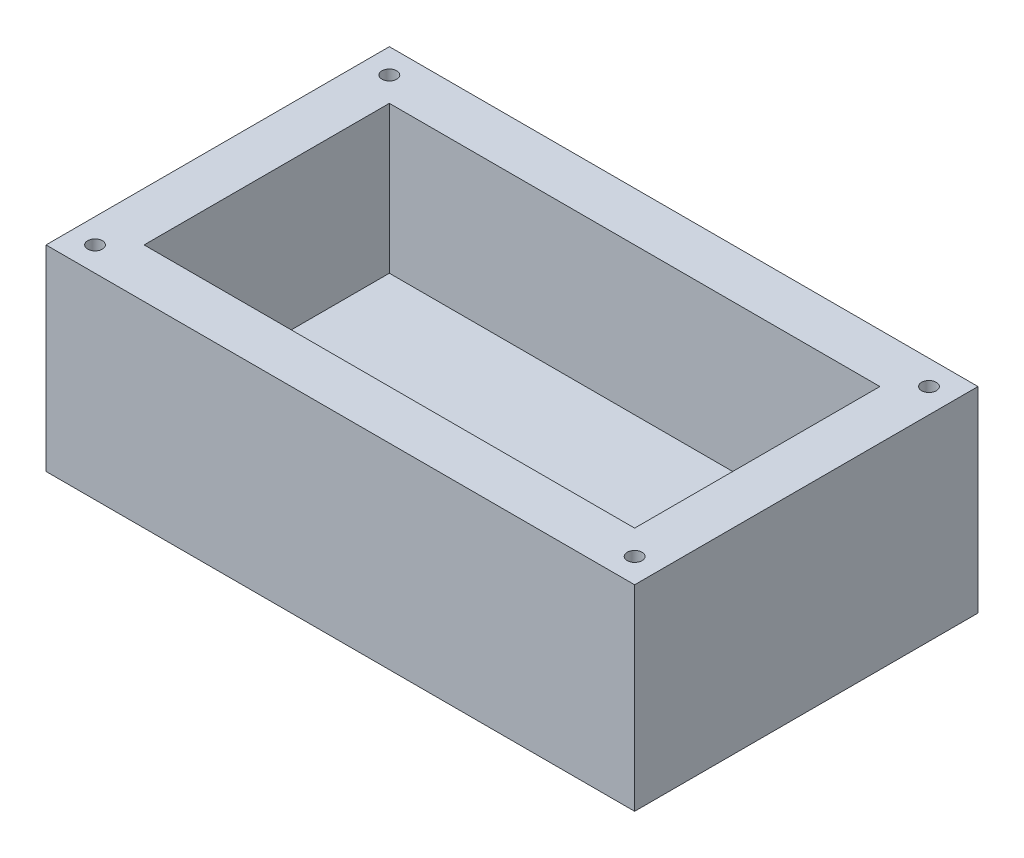
ISO-10303-21;
HEADER;
FILE_DESCRIPTION(('STEP AP214'),'2;1');
FILE_NAME('part.step','',(''),(''),'','','');
FILE_SCHEMA(('AUTOMOTIVE_DESIGN { 1 0 10303 214 1 1 1 1 }'));
ENDSEC;
DATA;
#1=APPLICATION_CONTEXT('core data for automotive mechanical design processes');
#2=APPLICATION_PROTOCOL_DEFINITION('international standard','automotive_design',2000,#1);
#3=PRODUCT_CONTEXT('',#1,'mechanical');
#4=PRODUCT('Part','Part','',(#3));
#5=PRODUCT_RELATED_PRODUCT_CATEGORY('part','',(#4));
#6=PRODUCT_DEFINITION_FORMATION('','',#4);
#7=PRODUCT_DEFINITION_CONTEXT('part definition',#1,'design');
#8=PRODUCT_DEFINITION('design','',#6,#7);
#9=PRODUCT_DEFINITION_SHAPE('','',#8);
#10=(LENGTH_UNIT() NAMED_UNIT(*) SI_UNIT(.MILLI.,.METRE.));
#11=(NAMED_UNIT(*) PLANE_ANGLE_UNIT() SI_UNIT($,.RADIAN.));
#12=(NAMED_UNIT(*) SI_UNIT($,.STERADIAN.) SOLID_ANGLE_UNIT());
#13=UNCERTAINTY_MEASURE_WITH_UNIT(LENGTH_MEASURE(1.E-05),#10,'distance_accuracy_value','');
#14=(GEOMETRIC_REPRESENTATION_CONTEXT(3) GLOBAL_UNCERTAINTY_ASSIGNED_CONTEXT((#13)) GLOBAL_UNIT_ASSIGNED_CONTEXT((#10,
#11,#12)) REPRESENTATION_CONTEXT('',''));
#15=CARTESIAN_POINT('',(0.,0.,0.));
#16=DIRECTION('',(0.,0.,1.));
#17=DIRECTION('',(1.,0.,0.));
#18=AXIS2_PLACEMENT_3D('',#15,#16,#17);
#19=CARTESIAN_POINT('',(60.,40.,-35.));
#20=DIRECTION('',(-1.,0.,0.));
#21=DIRECTION('',(0.,0.,1.));
#22=AXIS2_PLACEMENT_3D('',#19,#20,#21);
#23=PLANE('',#22);
#24=DIRECTION('',(0.,0.,-1.));
#25=VECTOR('',#24,1.);
#26=CARTESIAN_POINT('',(60.,0.,-35.));
#27=LINE('',#26,#25);
#28=CARTESIAN_POINT('',(60.,0.,35.));
#29=VERTEX_POINT('',#28);
#30=CARTESIAN_POINT('',(60.,0.,-35.));
#31=VERTEX_POINT('',#30);
#32=EDGE_CURVE('E147',#29,#31,#27,.T.);
#33=ORIENTED_EDGE('',*,*,#32,.T.);
#34=DIRECTION('',(0.,-1.,0.));
#35=VECTOR('',#34,1.);
#36=CARTESIAN_POINT('',(60.,40.,-35.));
#37=LINE('',#36,#35);
#38=CARTESIAN_POINT('',(60.,40.,-35.));
#39=VERTEX_POINT('',#38);
#40=EDGE_CURVE('E11',#39,#31,#37,.T.);
#41=ORIENTED_EDGE('',*,*,#40,.F.);
#42=DIRECTION('',(0.,0.,-1.));
#43=VECTOR('',#42,1.);
#44=CARTESIAN_POINT('',(60.,40.,-35.));
#45=LINE('',#44,#43);
#46=CARTESIAN_POINT('',(60.,40.,35.));
#47=VERTEX_POINT('',#46);
#48=EDGE_CURVE('E151',#47,#39,#45,.T.);
#49=ORIENTED_EDGE('',*,*,#48,.F.);
#50=DIRECTION('',(0.,-1.,0.));
#51=VECTOR('',#50,1.);
#52=CARTESIAN_POINT('',(60.,40.,35.));
#53=LINE('',#52,#51);
#54=EDGE_CURVE('E157',#47,#29,#53,.T.);
#55=ORIENTED_EDGE('',*,*,#54,.T.);
#56=EDGE_LOOP('',(#33,#41,#49,#55));
#57=FACE_BOUND('',#56,.T.);
#58=ADVANCED_FACE('F35',(#57),#23,.F.);
#59=CARTESIAN_POINT('',(-60.,40.,-35.));
#60=DIRECTION('',(0.,0.,1.));
#61=DIRECTION('',(1.,0.,0.));
#62=AXIS2_PLACEMENT_3D('',#59,#60,#61);
#63=PLANE('',#62);
#64=DIRECTION('',(-1.,0.,0.));
#65=VECTOR('',#64,1.);
#66=CARTESIAN_POINT('',(-60.,0.,-35.));
#67=LINE('',#66,#65);
#68=CARTESIAN_POINT('',(-60.,0.,-35.));
#69=VERTEX_POINT('',#68);
#70=EDGE_CURVE('E160',#31,#69,#67,.T.);
#71=ORIENTED_EDGE('',*,*,#70,.T.);
#72=DIRECTION('',(0.,-1.,0.));
#73=VECTOR('',#72,1.);
#74=CARTESIAN_POINT('',(-60.,40.,-35.));
#75=LINE('',#74,#73);
#76=CARTESIAN_POINT('',(-60.,40.,-35.));
#77=VERTEX_POINT('',#76);
#78=EDGE_CURVE('E42',#77,#69,#75,.T.);
#79=ORIENTED_EDGE('',*,*,#78,.F.);
#80=DIRECTION('',(-1.,0.,0.));
#81=VECTOR('',#80,1.);
#82=CARTESIAN_POINT('',(-60.,40.,-35.));
#83=LINE('',#82,#81);
#84=EDGE_CURVE('E86',#39,#77,#83,.T.);
#85=ORIENTED_EDGE('',*,*,#84,.F.);
#86=ORIENTED_EDGE('',*,*,#40,.T.);
#87=EDGE_LOOP('',(#71,#79,#85,#86));
#88=FACE_BOUND('',#87,.T.);
#89=ADVANCED_FACE('F189',(#88),#63,.F.);
#90=CARTESIAN_POINT('',(-60.,40.,-35.));
#91=DIRECTION('',(1.,0.,0.));
#92=DIRECTION('',(0.,0.,-1.));
#93=AXIS2_PLACEMENT_3D('',#90,#91,#92);
#94=PLANE('',#93);
#95=DIRECTION('',(0.,0.,1.));
#96=VECTOR('',#95,1.);
#97=CARTESIAN_POINT('',(-60.,0.,-35.));
#98=LINE('',#97,#96);
#99=CARTESIAN_POINT('',(-60.,0.,35.));
#100=VERTEX_POINT('',#99);
#101=EDGE_CURVE('E162',#69,#100,#98,.T.);
#102=ORIENTED_EDGE('',*,*,#101,.T.);
#103=DIRECTION('',(0.,-1.,0.));
#104=VECTOR('',#103,1.);
#105=CARTESIAN_POINT('',(-60.,40.,35.));
#106=LINE('',#105,#104);
#107=CARTESIAN_POINT('',(-60.,40.,35.));
#108=VERTEX_POINT('',#107);
#109=EDGE_CURVE('E166',#108,#100,#106,.T.);
#110=ORIENTED_EDGE('',*,*,#109,.F.);
#111=DIRECTION('',(0.,0.,1.));
#112=VECTOR('',#111,1.);
#113=CARTESIAN_POINT('',(-60.,40.,-35.));
#114=LINE('',#113,#112);
#115=EDGE_CURVE('E154',#77,#108,#114,.T.);
#116=ORIENTED_EDGE('',*,*,#115,.F.);
#117=ORIENTED_EDGE('',*,*,#78,.T.);
#118=EDGE_LOOP('',(#102,#110,#116,#117));
#119=FACE_BOUND('',#118,.T.);
#120=ADVANCED_FACE('F171',(#119),#94,.F.);
#121=CARTESIAN_POINT('',(-60.,40.,35.));
#122=DIRECTION('',(0.,0.,-1.));
#123=DIRECTION('',(-1.,0.,0.));
#124=AXIS2_PLACEMENT_3D('',#121,#122,#123);
#125=PLANE('',#124);
#126=DIRECTION('',(1.,0.,0.));
#127=VECTOR('',#126,1.);
#128=CARTESIAN_POINT('',(-60.,0.,35.));
#129=LINE('',#128,#127);
#130=EDGE_CURVE('E79',#100,#29,#129,.T.);
#131=ORIENTED_EDGE('',*,*,#130,.T.);
#132=ORIENTED_EDGE('',*,*,#54,.F.);
#133=DIRECTION('',(1.,0.,0.));
#134=VECTOR('',#133,1.);
#135=CARTESIAN_POINT('',(-60.,40.,35.));
#136=LINE('',#135,#134);
#137=EDGE_CURVE('E58',#108,#47,#136,.T.);
#138=ORIENTED_EDGE('',*,*,#137,.F.);
#139=ORIENTED_EDGE('',*,*,#109,.T.);
#140=EDGE_LOOP('',(#131,#132,#138,#139));
#141=FACE_BOUND('',#140,.T.);
#142=ADVANCED_FACE('F179',(#141),#125,.F.);
#143=CARTESIAN_POINT('',(0.,40.,0.));
#144=DIRECTION('',(0.,1.,0.));
#145=DIRECTION('',(0.,0.,1.));
#146=AXIS2_PLACEMENT_3D('',#143,#144,#145);
#147=PLANE('',#146);
#148=CARTESIAN_POINT('',(55.,40.,30.));
#149=DIRECTION('',(0.,1.,0.));
#150=DIRECTION('',(0.,0.,1.));
#151=AXIS2_PLACEMENT_3D('',#148,#149,#150);
#152=CIRCLE('',#151,1.5);
#153=CARTESIAN_POINT('',(55.,40.,31.5));
#154=VERTEX_POINT('',#153);
#155=EDGE_CURVE('E351',#154,#154,#152,.T.);
#156=ORIENTED_EDGE('',*,*,#155,.F.);
#157=EDGE_LOOP('',(#156));
#158=FACE_BOUND('',#157,.T.);
#159=CARTESIAN_POINT('',(55.,40.,-30.));
#160=DIRECTION('',(0.,1.,0.));
#161=DIRECTION('',(0.,0.,1.));
#162=AXIS2_PLACEMENT_3D('',#159,#160,#161);
#163=CIRCLE('',#162,1.5);
#164=CARTESIAN_POINT('',(55.,40.,-28.5));
#165=VERTEX_POINT('',#164);
#166=EDGE_CURVE('E350',#165,#165,#163,.T.);
#167=ORIENTED_EDGE('',*,*,#166,.F.);
#168=EDGE_LOOP('',(#167));
#169=FACE_BOUND('',#168,.T.);
#170=CARTESIAN_POINT('',(-55.,40.,-30.));
#171=DIRECTION('',(0.,1.,0.));
#172=DIRECTION('',(0.,0.,1.));
#173=AXIS2_PLACEMENT_3D('',#170,#171,#172);
#174=CIRCLE('',#173,1.5);
#175=CARTESIAN_POINT('',(-55.,40.,-28.5));
#176=VERTEX_POINT('',#175);
#177=EDGE_CURVE('E360',#176,#176,#174,.T.);
#178=ORIENTED_EDGE('',*,*,#177,.F.);
#179=EDGE_LOOP('',(#178));
#180=FACE_BOUND('',#179,.T.);
#181=CARTESIAN_POINT('',(-55.,40.,30.));
#182=DIRECTION('',(0.,1.,0.));
#183=DIRECTION('',(0.,0.,1.));
#184=AXIS2_PLACEMENT_3D('',#181,#182,#183);
#185=CIRCLE('',#184,1.5);
#186=CARTESIAN_POINT('',(-55.,40.,31.5));
#187=VERTEX_POINT('',#186);
#188=EDGE_CURVE('E134',#187,#187,#185,.T.);
#189=ORIENTED_EDGE('',*,*,#188,.F.);
#190=EDGE_LOOP('',(#189));
#191=FACE_BOUND('',#190,.T.);
#192=DIRECTION('',(0.,0.,-1.));
#193=VECTOR('',#192,1.);
#194=CARTESIAN_POINT('',(50.,40.,-25.));
#195=LINE('',#194,#193);
#196=CARTESIAN_POINT('',(50.,40.,25.));
#197=VERTEX_POINT('',#196);
#198=CARTESIAN_POINT('',(50.,40.,-25.));
#199=VERTEX_POINT('',#198);
#200=EDGE_CURVE('E49',#197,#199,#195,.T.);
#201=ORIENTED_EDGE('',*,*,#200,.F.);
#202=DIRECTION('',(1.,0.,0.));
#203=VECTOR('',#202,1.);
#204=CARTESIAN_POINT('',(-50.,40.,25.));
#205=LINE('',#204,#203);
#206=CARTESIAN_POINT('',(-50.,40.,25.));
#207=VERTEX_POINT('',#206);
#208=EDGE_CURVE('E128',#207,#197,#205,.T.);
#209=ORIENTED_EDGE('',*,*,#208,.F.);
#210=DIRECTION('',(0.,0.,1.));
#211=VECTOR('',#210,1.);
#212=CARTESIAN_POINT('',(-50.,40.,-25.));
#213=LINE('',#212,#211);
#214=CARTESIAN_POINT('',(-50.,40.,-25.));
#215=VERTEX_POINT('',#214);
#216=EDGE_CURVE('E131',#215,#207,#213,.T.);
#217=ORIENTED_EDGE('',*,*,#216,.F.);
#218=DIRECTION('',(-1.,0.,0.));
#219=VECTOR('',#218,1.);
#220=CARTESIAN_POINT('',(-50.,40.,-25.));
#221=LINE('',#220,#219);
#222=EDGE_CURVE('E140',#199,#215,#221,.T.);
#223=ORIENTED_EDGE('',*,*,#222,.F.);
#224=EDGE_LOOP('',(#201,#209,#217,#223));
#225=FACE_BOUND('',#224,.T.);
#226=ORIENTED_EDGE('',*,*,#48,.T.);
#227=ORIENTED_EDGE('',*,*,#84,.T.);
#228=ORIENTED_EDGE('',*,*,#115,.T.);
#229=ORIENTED_EDGE('',*,*,#137,.T.);
#230=EDGE_LOOP('',(#226,#227,#228,#229));
#231=FACE_BOUND('',#230,.T.);
#232=ADVANCED_FACE('F181',(#158,#169,#180,#191,#225,#231),#147,.T.);
#233=CARTESIAN_POINT('',(0.,0.,0.));
#234=DIRECTION('',(0.,1.,0.));
#235=DIRECTION('',(0.,0.,1.));
#236=AXIS2_PLACEMENT_3D('',#233,#234,#235);
#237=PLANE('',#236);
#238=ORIENTED_EDGE('',*,*,#32,.F.);
#239=ORIENTED_EDGE('',*,*,#130,.F.);
#240=ORIENTED_EDGE('',*,*,#101,.F.);
#241=ORIENTED_EDGE('',*,*,#70,.F.);
#242=EDGE_LOOP('',(#238,#239,#240,#241));
#243=FACE_BOUND('',#242,.T.);
#244=ADVANCED_FACE('F175',(#243),#237,.F.);
#245=CARTESIAN_POINT('',(50.,10.,-25.));
#246=DIRECTION('',(1.,0.,0.));
#247=DIRECTION('',(0.,0.,-1.));
#248=AXIS2_PLACEMENT_3D('',#245,#246,#247);
#249=PLANE('',#248);
#250=ORIENTED_EDGE('',*,*,#200,.T.);
#251=DIRECTION('',(0.,1.,0.));
#252=VECTOR('',#251,1.);
#253=CARTESIAN_POINT('',(50.,10.,-25.));
#254=LINE('',#253,#252);
#255=CARTESIAN_POINT('',(50.,10.,-25.));
#256=VERTEX_POINT('',#255);
#257=EDGE_CURVE('E106',#256,#199,#254,.T.);
#258=ORIENTED_EDGE('',*,*,#257,.F.);
#259=DIRECTION('',(0.,0.,-1.));
#260=VECTOR('',#259,1.);
#261=CARTESIAN_POINT('',(50.,10.,-25.));
#262=LINE('',#261,#260);
#263=CARTESIAN_POINT('',(50.,10.,25.));
#264=VERTEX_POINT('',#263);
#265=EDGE_CURVE('E110',#264,#256,#262,.T.);
#266=ORIENTED_EDGE('',*,*,#265,.F.);
#267=DIRECTION('',(0.,1.,0.));
#268=VECTOR('',#267,1.);
#269=CARTESIAN_POINT('',(50.,10.,25.));
#270=LINE('',#269,#268);
#271=EDGE_CURVE('E145',#264,#197,#270,.T.);
#272=ORIENTED_EDGE('',*,*,#271,.T.);
#273=EDGE_LOOP('',(#250,#258,#266,#272));
#274=FACE_BOUND('',#273,.T.);
#275=ADVANCED_FACE('F108',(#274),#249,.F.);
#276=CARTESIAN_POINT('',(-50.,10.,25.));
#277=DIRECTION('',(0.,0.,1.));
#278=DIRECTION('',(1.,0.,0.));
#279=AXIS2_PLACEMENT_3D('',#276,#277,#278);
#280=PLANE('',#279);
#281=ORIENTED_EDGE('',*,*,#208,.T.);
#282=ORIENTED_EDGE('',*,*,#271,.F.);
#283=DIRECTION('',(1.,0.,0.));
#284=VECTOR('',#283,1.);
#285=CARTESIAN_POINT('',(-50.,10.,25.));
#286=LINE('',#285,#284);
#287=CARTESIAN_POINT('',(-50.,10.,25.));
#288=VERTEX_POINT('',#287);
#289=EDGE_CURVE('E116',#288,#264,#286,.T.);
#290=ORIENTED_EDGE('',*,*,#289,.F.);
#291=DIRECTION('',(0.,1.,0.));
#292=VECTOR('',#291,1.);
#293=CARTESIAN_POINT('',(-50.,10.,25.));
#294=LINE('',#293,#292);
#295=EDGE_CURVE('E148',#288,#207,#294,.T.);
#296=ORIENTED_EDGE('',*,*,#295,.T.);
#297=EDGE_LOOP('',(#281,#282,#290,#296));
#298=FACE_BOUND('',#297,.T.);
#299=ADVANCED_FACE('F223',(#298),#280,.F.);
#300=CARTESIAN_POINT('',(-50.,10.,-25.));
#301=DIRECTION('',(-1.,0.,0.));
#302=DIRECTION('',(0.,0.,1.));
#303=AXIS2_PLACEMENT_3D('',#300,#301,#302);
#304=PLANE('',#303);
#305=ORIENTED_EDGE('',*,*,#216,.T.);
#306=ORIENTED_EDGE('',*,*,#295,.F.);
#307=DIRECTION('',(0.,0.,1.));
#308=VECTOR('',#307,1.);
#309=CARTESIAN_POINT('',(-50.,10.,-25.));
#310=LINE('',#309,#308);
#311=CARTESIAN_POINT('',(-50.,10.,-25.));
#312=VERTEX_POINT('',#311);
#313=EDGE_CURVE('E124',#312,#288,#310,.T.);
#314=ORIENTED_EDGE('',*,*,#313,.F.);
#315=DIRECTION('',(0.,1.,0.));
#316=VECTOR('',#315,1.);
#317=CARTESIAN_POINT('',(-50.,10.,-25.));
#318=LINE('',#317,#316);
#319=EDGE_CURVE('E115',#312,#215,#318,.T.);
#320=ORIENTED_EDGE('',*,*,#319,.T.);
#321=EDGE_LOOP('',(#305,#306,#314,#320));
#322=FACE_BOUND('',#321,.T.);
#323=ADVANCED_FACE('F232',(#322),#304,.F.);
#324=CARTESIAN_POINT('',(-50.,10.,-25.));
#325=DIRECTION('',(0.,0.,-1.));
#326=DIRECTION('',(-1.,0.,0.));
#327=AXIS2_PLACEMENT_3D('',#324,#325,#326);
#328=PLANE('',#327);
#329=ORIENTED_EDGE('',*,*,#222,.T.);
#330=ORIENTED_EDGE('',*,*,#319,.F.);
#331=DIRECTION('',(-1.,0.,0.));
#332=VECTOR('',#331,1.);
#333=CARTESIAN_POINT('',(-50.,10.,-25.));
#334=LINE('',#333,#332);
#335=EDGE_CURVE('E119',#256,#312,#334,.T.);
#336=ORIENTED_EDGE('',*,*,#335,.F.);
#337=ORIENTED_EDGE('',*,*,#257,.T.);
#338=EDGE_LOOP('',(#329,#330,#336,#337));
#339=FACE_BOUND('',#338,.T.);
#340=ADVANCED_FACE('F120',(#339),#328,.F.);
#341=CARTESIAN_POINT('',(0.,10.,0.));
#342=DIRECTION('',(0.,1.,0.));
#343=DIRECTION('',(0.,0.,1.));
#344=AXIS2_PLACEMENT_3D('',#341,#342,#343);
#345=PLANE('',#344);
#346=ORIENTED_EDGE('',*,*,#265,.T.);
#347=ORIENTED_EDGE('',*,*,#335,.T.);
#348=ORIENTED_EDGE('',*,*,#313,.T.);
#349=ORIENTED_EDGE('',*,*,#289,.T.);
#350=EDGE_LOOP('',(#346,#347,#348,#349));
#351=FACE_BOUND('',#350,.T.);
#352=ADVANCED_FACE('F126',(#351),#345,.T.);
#353=CARTESIAN_POINT('',(-55.,30.,30.));
#354=DIRECTION('',(0.,1.,0.));
#355=DIRECTION('',(0.,0.,1.));
#356=AXIS2_PLACEMENT_3D('',#353,#354,#355);
#357=CYLINDRICAL_SURFACE('',#356,1.5);
#358=CARTESIAN_POINT('',(-55.,30.,30.));
#359=DIRECTION('',(0.,1.,0.));
#360=DIRECTION('',(0.,0.,1.));
#361=AXIS2_PLACEMENT_3D('',#358,#359,#360);
#362=CIRCLE('',#361,1.5);
#363=CARTESIAN_POINT('',(-55.,30.,31.5));
#364=VERTEX_POINT('',#363);
#365=EDGE_CURVE('E141',#364,#364,#362,.T.);
#366=ORIENTED_EDGE('',*,*,#365,.F.);
#367=EDGE_LOOP('',(#366));
#368=FACE_BOUND('',#367,.T.);
#369=ORIENTED_EDGE('',*,*,#188,.T.);
#370=EDGE_LOOP('',(#369));
#371=FACE_BOUND('',#370,.T.);
#372=ADVANCED_FACE('F259',(#368,#371),#357,.F.);
#373=CARTESIAN_POINT('',(-55.,30.,30.));
#374=DIRECTION('',(0.,1.,0.));
#375=DIRECTION('',(0.,0.,1.));
#376=AXIS2_PLACEMENT_3D('',#373,#374,#375);
#377=PLANE('',#376);
#378=ORIENTED_EDGE('',*,*,#365,.T.);
#379=EDGE_LOOP('',(#378));
#380=FACE_BOUND('',#379,.T.);
#381=ADVANCED_FACE('F273',(#380),#377,.T.);
#382=CARTESIAN_POINT('',(-55.,30.,-30.));
#383=DIRECTION('',(0.,1.,0.));
#384=DIRECTION('',(0.,0.,1.));
#385=AXIS2_PLACEMENT_3D('',#382,#383,#384);
#386=CYLINDRICAL_SURFACE('',#385,1.5);
#387=CARTESIAN_POINT('',(-55.,30.,-30.));
#388=DIRECTION('',(0.,1.,0.));
#389=DIRECTION('',(0.,0.,1.));
#390=AXIS2_PLACEMENT_3D('',#387,#388,#389);
#391=CIRCLE('',#390,1.5);
#392=CARTESIAN_POINT('',(-55.,30.,-28.5));
#393=VERTEX_POINT('',#392);
#394=EDGE_CURVE('E362',#393,#393,#391,.T.);
#395=ORIENTED_EDGE('',*,*,#394,.F.);
#396=EDGE_LOOP('',(#395));
#397=FACE_BOUND('',#396,.T.);
#398=ORIENTED_EDGE('',*,*,#177,.T.);
#399=EDGE_LOOP('',(#398));
#400=FACE_BOUND('',#399,.T.);
#401=ADVANCED_FACE('F283',(#397,#400),#386,.F.);
#402=CARTESIAN_POINT('',(-55.,30.,-30.));
#403=DIRECTION('',(0.,1.,0.));
#404=DIRECTION('',(0.,0.,1.));
#405=AXIS2_PLACEMENT_3D('',#402,#403,#404);
#406=PLANE('',#405);
#407=ORIENTED_EDGE('',*,*,#394,.T.);
#408=EDGE_LOOP('',(#407));
#409=FACE_BOUND('',#408,.T.);
#410=ADVANCED_FACE('F293',(#409),#406,.T.);
#411=CARTESIAN_POINT('',(55.,30.,-30.));
#412=DIRECTION('',(0.,1.,0.));
#413=DIRECTION('',(0.,0.,1.));
#414=AXIS2_PLACEMENT_3D('',#411,#412,#413);
#415=CYLINDRICAL_SURFACE('',#414,1.5);
#416=CARTESIAN_POINT('',(55.,30.,-30.));
#417=DIRECTION('',(0.,1.,0.));
#418=DIRECTION('',(0.,0.,1.));
#419=AXIS2_PLACEMENT_3D('',#416,#417,#418);
#420=CIRCLE('',#419,1.5);
#421=CARTESIAN_POINT('',(55.,30.,-28.5));
#422=VERTEX_POINT('',#421);
#423=EDGE_CURVE('E354',#422,#422,#420,.T.);
#424=ORIENTED_EDGE('',*,*,#423,.F.);
#425=EDGE_LOOP('',(#424));
#426=FACE_BOUND('',#425,.T.);
#427=ORIENTED_EDGE('',*,*,#166,.T.);
#428=EDGE_LOOP('',(#427));
#429=FACE_BOUND('',#428,.T.);
#430=ADVANCED_FACE('F303',(#426,#429),#415,.F.);
#431=CARTESIAN_POINT('',(55.,30.,-30.));
#432=DIRECTION('',(0.,1.,0.));
#433=DIRECTION('',(0.,0.,1.));
#434=AXIS2_PLACEMENT_3D('',#431,#432,#433);
#435=PLANE('',#434);
#436=ORIENTED_EDGE('',*,*,#423,.T.);
#437=EDGE_LOOP('',(#436));
#438=FACE_BOUND('',#437,.T.);
#439=ADVANCED_FACE('F313',(#438),#435,.T.);
#440=CARTESIAN_POINT('',(55.,30.,30.));
#441=DIRECTION('',(0.,1.,0.));
#442=DIRECTION('',(0.,0.,1.));
#443=AXIS2_PLACEMENT_3D('',#440,#441,#442);
#444=CYLINDRICAL_SURFACE('',#443,1.5);
#445=CARTESIAN_POINT('',(55.,30.,30.));
#446=DIRECTION('',(0.,1.,0.));
#447=DIRECTION('',(0.,0.,1.));
#448=AXIS2_PLACEMENT_3D('',#445,#446,#447);
#449=CIRCLE('',#448,1.5);
#450=CARTESIAN_POINT('',(55.,30.,31.5));
#451=VERTEX_POINT('',#450);
#452=EDGE_CURVE('E349',#451,#451,#449,.T.);
#453=ORIENTED_EDGE('',*,*,#452,.F.);
#454=EDGE_LOOP('',(#453));
#455=FACE_BOUND('',#454,.T.);
#456=ORIENTED_EDGE('',*,*,#155,.T.);
#457=EDGE_LOOP('',(#456));
#458=FACE_BOUND('',#457,.T.);
#459=ADVANCED_FACE('F323',(#455,#458),#444,.F.);
#460=CARTESIAN_POINT('',(55.,30.,30.));
#461=DIRECTION('',(0.,1.,0.));
#462=DIRECTION('',(0.,0.,1.));
#463=AXIS2_PLACEMENT_3D('',#460,#461,#462);
#464=PLANE('',#463);
#465=ORIENTED_EDGE('',*,*,#452,.T.);
#466=EDGE_LOOP('',(#465));
#467=FACE_BOUND('',#466,.T.);
#468=ADVANCED_FACE('F333',(#467),#464,.T.);
#469=CLOSED_SHELL('',(#58,#89,#120,#142,#232,#244,#275,#299,#323,#340,#352,#372,#381,#401,#410,
#430,#439,#459,#468));
#470=MANIFOLD_SOLID_BREP('B2',#469);
#471=ADVANCED_BREP_SHAPE_REPRESENTATION('',(#18,#470),#14);
#472=SHAPE_DEFINITION_REPRESENTATION(#9,#471);
ENDSEC;
END-ISO-10303-21;
